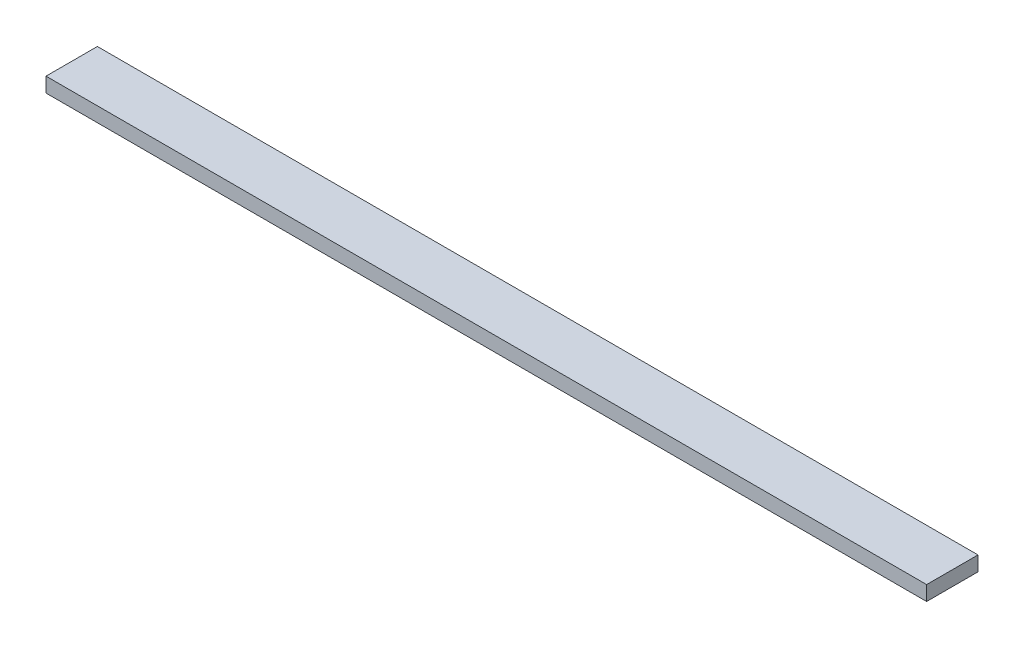
ISO-10303-21;
HEADER;
FILE_DESCRIPTION(('STEP AP214'),'2;1');
FILE_NAME('part.step','',(''),(''),'','','');
FILE_SCHEMA(('AUTOMOTIVE_DESIGN { 1 0 10303 214 1 1 1 1 }'));
ENDSEC;
DATA;
#1=APPLICATION_CONTEXT('core data for automotive mechanical design processes');
#2=APPLICATION_PROTOCOL_DEFINITION('international standard','automotive_design',2000,#1);
#3=PRODUCT_CONTEXT('',#1,'mechanical');
#4=PRODUCT('Part','Part','',(#3));
#5=PRODUCT_RELATED_PRODUCT_CATEGORY('part','',(#4));
#6=PRODUCT_DEFINITION_FORMATION('','',#4);
#7=PRODUCT_DEFINITION_CONTEXT('part definition',#1,'design');
#8=PRODUCT_DEFINITION('design','',#6,#7);
#9=PRODUCT_DEFINITION_SHAPE('','',#8);
#10=(LENGTH_UNIT() NAMED_UNIT(*) SI_UNIT(.MILLI.,.METRE.));
#11=(NAMED_UNIT(*) PLANE_ANGLE_UNIT() SI_UNIT($,.RADIAN.));
#12=(NAMED_UNIT(*) SI_UNIT($,.STERADIAN.) SOLID_ANGLE_UNIT());
#13=UNCERTAINTY_MEASURE_WITH_UNIT(LENGTH_MEASURE(1.E-05),#10,'distance_accuracy_value','');
#14=(GEOMETRIC_REPRESENTATION_CONTEXT(3) GLOBAL_UNCERTAINTY_ASSIGNED_CONTEXT((#13)) GLOBAL_UNIT_ASSIGNED_CONTEXT((#10,
#11,#12)) REPRESENTATION_CONTEXT('',''));
#15=CARTESIAN_POINT('',(0.,0.,0.));
#16=DIRECTION('',(0.,0.,1.));
#17=DIRECTION('',(1.,0.,0.));
#18=AXIS2_PLACEMENT_3D('',#15,#16,#17);
#19=CARTESIAN_POINT('',(0.,10.,0.));
#20=DIRECTION('',(1.,0.,0.));
#21=DIRECTION('',(0.,0.,-1.));
#22=AXIS2_PLACEMENT_3D('',#19,#20,#21);
#23=PLANE('',#22);
#24=DIRECTION('',(0.,0.,1.));
#25=VECTOR('',#24,1.);
#26=CARTESIAN_POINT('',(0.,0.,0.));
#27=LINE('',#26,#25);
#28=CARTESIAN_POINT('',(0.,0.,0.));
#29=VERTEX_POINT('',#28);
#30=CARTESIAN_POINT('',(0.,0.,35.));
#31=VERTEX_POINT('',#30);
#32=EDGE_CURVE('E107',#29,#31,#27,.T.);
#33=ORIENTED_EDGE('',*,*,#32,.T.);
#34=DIRECTION('',(0.,-1.,0.));
#35=VECTOR('',#34,1.);
#36=CARTESIAN_POINT('',(0.,10.,35.));
#37=LINE('',#36,#35);
#38=CARTESIAN_POINT('',(0.,10.,35.));
#39=VERTEX_POINT('',#38);
#40=EDGE_CURVE('E11',#39,#31,#37,.T.);
#41=ORIENTED_EDGE('',*,*,#40,.F.);
#42=DIRECTION('',(0.,0.,1.));
#43=VECTOR('',#42,1.);
#44=CARTESIAN_POINT('',(0.,10.,0.));
#45=LINE('',#44,#43);
#46=CARTESIAN_POINT('',(0.,10.,0.));
#47=VERTEX_POINT('',#46);
#48=EDGE_CURVE('E91',#47,#39,#45,.T.);
#49=ORIENTED_EDGE('',*,*,#48,.F.);
#50=DIRECTION('',(0.,-1.,0.));
#51=VECTOR('',#50,1.);
#52=CARTESIAN_POINT('',(0.,10.,0.));
#53=LINE('',#52,#51);
#54=EDGE_CURVE('E103',#47,#29,#53,.T.);
#55=ORIENTED_EDGE('',*,*,#54,.T.);
#56=EDGE_LOOP('',(#33,#41,#49,#55));
#57=FACE_BOUND('',#56,.T.);
#58=ADVANCED_FACE('F39',(#57),#23,.F.);
#59=CARTESIAN_POINT('',(0.,10.,35.));
#60=DIRECTION('',(0.,0.,-1.));
#61=DIRECTION('',(-1.,0.,0.));
#62=AXIS2_PLACEMENT_3D('',#59,#60,#61);
#63=PLANE('',#62);
#64=DIRECTION('',(1.,0.,0.));
#65=VECTOR('',#64,1.);
#66=CARTESIAN_POINT('',(0.,0.,35.));
#67=LINE('',#66,#65);
#68=CARTESIAN_POINT('',(600.,0.,35.));
#69=VERTEX_POINT('',#68);
#70=EDGE_CURVE('E96',#31,#69,#67,.T.);
#71=ORIENTED_EDGE('',*,*,#70,.T.);
#72=DIRECTION('',(0.,-1.,0.));
#73=VECTOR('',#72,1.);
#74=CARTESIAN_POINT('',(600.,10.,35.));
#75=LINE('',#74,#73);
#76=CARTESIAN_POINT('',(600.,10.,35.));
#77=VERTEX_POINT('',#76);
#78=EDGE_CURVE('E48',#77,#69,#75,.T.);
#79=ORIENTED_EDGE('',*,*,#78,.F.);
#80=DIRECTION('',(1.,0.,0.));
#81=VECTOR('',#80,1.);
#82=CARTESIAN_POINT('',(0.,10.,35.));
#83=LINE('',#82,#81);
#84=EDGE_CURVE('E86',#39,#77,#83,.T.);
#85=ORIENTED_EDGE('',*,*,#84,.F.);
#86=ORIENTED_EDGE('',*,*,#40,.T.);
#87=EDGE_LOOP('',(#71,#79,#85,#86));
#88=FACE_BOUND('',#87,.T.);
#89=ADVANCED_FACE('F95',(#88),#63,.F.);
#90=CARTESIAN_POINT('',(600.,10.,0.));
#91=DIRECTION('',(-1.,0.,0.));
#92=DIRECTION('',(0.,0.,1.));
#93=AXIS2_PLACEMENT_3D('',#90,#91,#92);
#94=PLANE('',#93);
#95=DIRECTION('',(0.,0.,-1.));
#96=VECTOR('',#95,1.);
#97=CARTESIAN_POINT('',(600.,0.,0.));
#98=LINE('',#97,#96);
#99=CARTESIAN_POINT('',(600.,0.,0.));
#100=VERTEX_POINT('',#99);
#101=EDGE_CURVE('E73',#69,#100,#98,.T.);
#102=ORIENTED_EDGE('',*,*,#101,.T.);
#103=DIRECTION('',(0.,-1.,0.));
#104=VECTOR('',#103,1.);
#105=CARTESIAN_POINT('',(600.,10.,0.));
#106=LINE('',#105,#104);
#107=CARTESIAN_POINT('',(600.,10.,0.));
#108=VERTEX_POINT('',#107);
#109=EDGE_CURVE('E98',#108,#100,#106,.T.);
#110=ORIENTED_EDGE('',*,*,#109,.F.);
#111=DIRECTION('',(0.,0.,-1.));
#112=VECTOR('',#111,1.);
#113=CARTESIAN_POINT('',(600.,10.,0.));
#114=LINE('',#113,#112);
#115=EDGE_CURVE('E89',#77,#108,#114,.T.);
#116=ORIENTED_EDGE('',*,*,#115,.F.);
#117=ORIENTED_EDGE('',*,*,#78,.T.);
#118=EDGE_LOOP('',(#102,#110,#116,#117));
#119=FACE_BOUND('',#118,.T.);
#120=ADVANCED_FACE('F99',(#119),#94,.F.);
#121=CARTESIAN_POINT('',(0.,10.,0.));
#122=DIRECTION('',(0.,0.,1.));
#123=DIRECTION('',(1.,0.,0.));
#124=AXIS2_PLACEMENT_3D('',#121,#122,#123);
#125=PLANE('',#124);
#126=DIRECTION('',(-1.,0.,0.));
#127=VECTOR('',#126,1.);
#128=CARTESIAN_POINT('',(0.,0.,0.));
#129=LINE('',#128,#127);
#130=EDGE_CURVE('E79',#100,#29,#129,.T.);
#131=ORIENTED_EDGE('',*,*,#130,.T.);
#132=ORIENTED_EDGE('',*,*,#54,.F.);
#133=DIRECTION('',(-1.,0.,0.));
#134=VECTOR('',#133,1.);
#135=CARTESIAN_POINT('',(0.,10.,0.));
#136=LINE('',#135,#134);
#137=EDGE_CURVE('E56',#108,#47,#136,.T.);
#138=ORIENTED_EDGE('',*,*,#137,.F.);
#139=ORIENTED_EDGE('',*,*,#109,.T.);
#140=EDGE_LOOP('',(#131,#132,#138,#139));
#141=FACE_BOUND('',#140,.T.);
#142=ADVANCED_FACE('F120',(#141),#125,.F.);
#143=CARTESIAN_POINT('',(0.,10.,0.));
#144=DIRECTION('',(0.,1.,0.));
#145=DIRECTION('',(0.,0.,1.));
#146=AXIS2_PLACEMENT_3D('',#143,#144,#145);
#147=PLANE('',#146);
#148=ORIENTED_EDGE('',*,*,#48,.T.);
#149=ORIENTED_EDGE('',*,*,#84,.T.);
#150=ORIENTED_EDGE('',*,*,#115,.T.);
#151=ORIENTED_EDGE('',*,*,#137,.T.);
#152=EDGE_LOOP('',(#148,#149,#150,#151));
#153=FACE_BOUND('',#152,.T.);
#154=ADVANCED_FACE('F87',(#153),#147,.T.);
#155=CARTESIAN_POINT('',(0.,0.,0.));
#156=DIRECTION('',(0.,1.,0.));
#157=DIRECTION('',(0.,0.,1.));
#158=AXIS2_PLACEMENT_3D('',#155,#156,#157);
#159=PLANE('',#158);
#160=ORIENTED_EDGE('',*,*,#32,.F.);
#161=ORIENTED_EDGE('',*,*,#130,.F.);
#162=ORIENTED_EDGE('',*,*,#101,.F.);
#163=ORIENTED_EDGE('',*,*,#70,.F.);
#164=EDGE_LOOP('',(#160,#161,#162,#163));
#165=FACE_BOUND('',#164,.T.);
#166=ADVANCED_FACE('F123',(#165),#159,.F.);
#167=CLOSED_SHELL('',(#58,#89,#120,#142,#154,#166));
#168=MANIFOLD_SOLID_BREP('B2',#167);
#169=ADVANCED_BREP_SHAPE_REPRESENTATION('',(#18,#168),#14);
#170=SHAPE_DEFINITION_REPRESENTATION(#9,#169);
ENDSEC;
END-ISO-10303-21;
